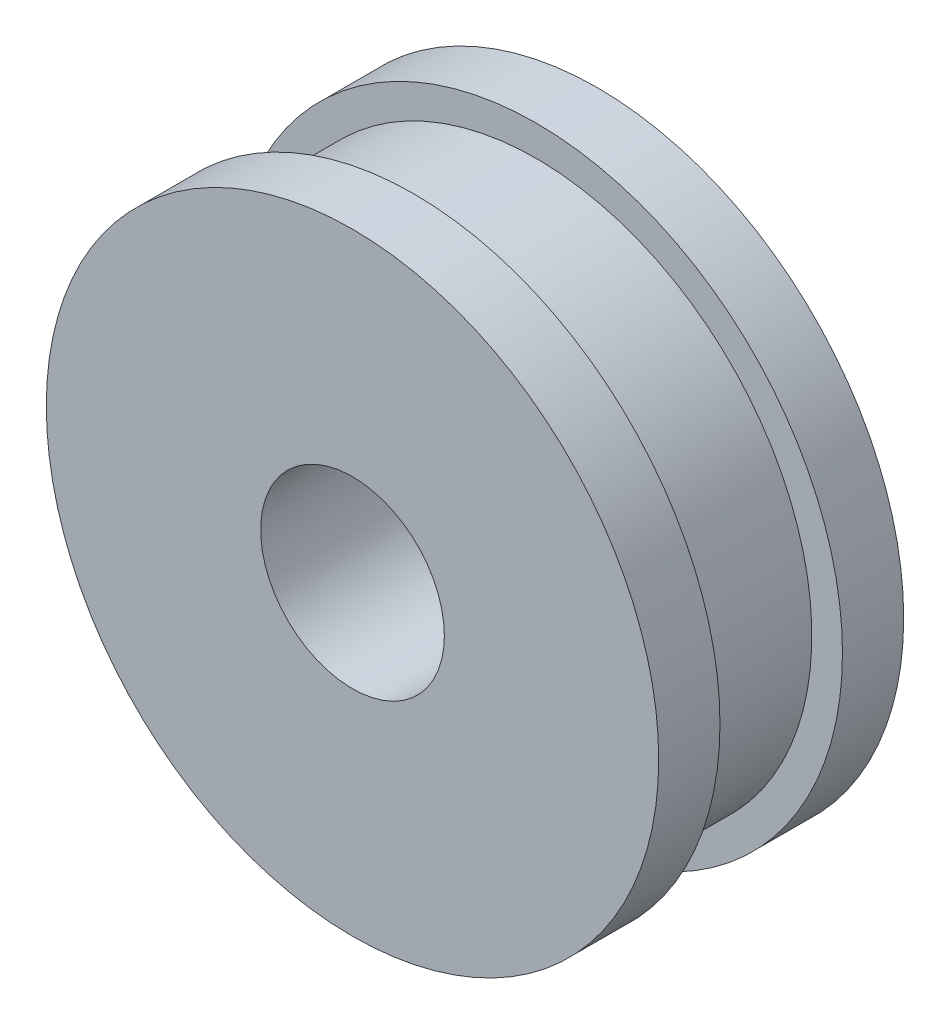
ISO-10303-21;
HEADER;
FILE_DESCRIPTION(('STEP AP214'),'2;1');
FILE_NAME('part.step','',(''),(''),'','','');
FILE_SCHEMA(('AUTOMOTIVE_DESIGN { 1 0 10303 214 1 1 1 1 }'));
ENDSEC;
DATA;
#1=APPLICATION_CONTEXT('core data for automotive mechanical design processes');
#2=APPLICATION_PROTOCOL_DEFINITION('international standard','automotive_design',2000,#1);
#3=PRODUCT_CONTEXT('',#1,'mechanical');
#4=PRODUCT('Part','Part','',(#3));
#5=PRODUCT_RELATED_PRODUCT_CATEGORY('part','',(#4));
#6=PRODUCT_DEFINITION_FORMATION('','',#4);
#7=PRODUCT_DEFINITION_CONTEXT('part definition',#1,'design');
#8=PRODUCT_DEFINITION('design','',#6,#7);
#9=PRODUCT_DEFINITION_SHAPE('','',#8);
#10=(LENGTH_UNIT() NAMED_UNIT(*) SI_UNIT(.MILLI.,.METRE.));
#11=(NAMED_UNIT(*) PLANE_ANGLE_UNIT() SI_UNIT($,.RADIAN.));
#12=(NAMED_UNIT(*) SI_UNIT($,.STERADIAN.) SOLID_ANGLE_UNIT());
#13=UNCERTAINTY_MEASURE_WITH_UNIT(LENGTH_MEASURE(1.E-05),#10,'distance_accuracy_value','');
#14=(GEOMETRIC_REPRESENTATION_CONTEXT(3) GLOBAL_UNCERTAINTY_ASSIGNED_CONTEXT((#13)) GLOBAL_UNIT_ASSIGNED_CONTEXT((#10,
#11,#12)) REPRESENTATION_CONTEXT('',''));
#15=CARTESIAN_POINT('',(0.,0.,0.));
#16=DIRECTION('',(0.,0.,1.));
#17=DIRECTION('',(1.,0.,0.));
#18=AXIS2_PLACEMENT_3D('',#15,#16,#17);
#19=CARTESIAN_POINT('',(0.,0.,40.));
#20=DIRECTION('',(0.,0.,-1.));
#21=DIRECTION('',(-1.,0.,0.));
#22=AXIS2_PLACEMENT_3D('',#19,#20,#21);
#23=CYLINDRICAL_SURFACE('',#22,50.);
#24=CARTESIAN_POINT('',(0.,0.,30.));
#25=DIRECTION('',(0.,0.,-1.));
#26=DIRECTION('',(-1.,0.,0.));
#27=AXIS2_PLACEMENT_3D('',#24,#25,#26);
#28=CIRCLE('',#27,50.);
#29=CARTESIAN_POINT('',(-50.,0.,30.));
#30=VERTEX_POINT('',#29);
#31=EDGE_CURVE('E58',#30,#30,#28,.T.);
#32=ORIENTED_EDGE('',*,*,#31,.F.);
#33=EDGE_LOOP('',(#32));
#34=FACE_BOUND('',#33,.T.);
#35=CARTESIAN_POINT('',(0.,0.,40.));
#36=DIRECTION('',(0.,0.,1.));
#37=DIRECTION('',(1.,0.,0.));
#38=AXIS2_PLACEMENT_3D('',#35,#36,#37);
#39=CIRCLE('',#38,50.);
#40=CARTESIAN_POINT('',(50.,0.,40.));
#41=VERTEX_POINT('',#40);
#42=EDGE_CURVE('E10',#41,#41,#39,.T.);
#43=ORIENTED_EDGE('',*,*,#42,.F.);
#44=EDGE_LOOP('',(#43));
#45=FACE_BOUND('',#44,.T.);
#46=ADVANCED_FACE('F31',(#34,#45),#23,.T.);
#47=CARTESIAN_POINT('',(0.,0.,40.));
#48=DIRECTION('',(0.,0.,1.));
#49=DIRECTION('',(1.,0.,0.));
#50=AXIS2_PLACEMENT_3D('',#47,#48,#49);
#51=PLANE('',#50);
#52=ORIENTED_EDGE('',*,*,#42,.T.);
#53=EDGE_LOOP('',(#52));
#54=FACE_BOUND('',#53,.T.);
#55=CARTESIAN_POINT('',(0.,0.,40.));
#56=DIRECTION('',(0.,0.,1.));
#57=DIRECTION('',(1.,0.,0.));
#58=AXIS2_PLACEMENT_3D('',#55,#56,#57);
#59=CIRCLE('',#58,15.);
#60=CARTESIAN_POINT('',(15.,0.,40.));
#61=VERTEX_POINT('',#60);
#62=EDGE_CURVE('E42',#61,#61,#59,.T.);
#63=ORIENTED_EDGE('',*,*,#62,.F.);
#64=EDGE_LOOP('',(#63));
#65=FACE_BOUND('',#64,.T.);
#66=ADVANCED_FACE('F66',(#54,#65),#51,.T.);
#67=CARTESIAN_POINT('',(0.,0.,0.));
#68=DIRECTION('',(0.,0.,1.));
#69=DIRECTION('',(1.,0.,0.));
#70=AXIS2_PLACEMENT_3D('',#67,#68,#69);
#71=PLANE('',#70);
#72=CARTESIAN_POINT('',(0.,0.,0.));
#73=DIRECTION('',(0.,0.,1.));
#74=DIRECTION('',(1.,0.,0.));
#75=AXIS2_PLACEMENT_3D('',#72,#73,#74);
#76=CIRCLE('',#75,50.);
#77=CARTESIAN_POINT('',(50.,0.,0.));
#78=VERTEX_POINT('',#77);
#79=EDGE_CURVE('E35',#78,#78,#76,.T.);
#80=ORIENTED_EDGE('',*,*,#79,.F.);
#81=EDGE_LOOP('',(#80));
#82=FACE_BOUND('',#81,.T.);
#83=CARTESIAN_POINT('',(0.,0.,0.));
#84=DIRECTION('',(0.,0.,1.));
#85=DIRECTION('',(1.,0.,0.));
#86=AXIS2_PLACEMENT_3D('',#83,#84,#85);
#87=CIRCLE('',#86,15.);
#88=CARTESIAN_POINT('',(15.,0.,0.));
#89=VERTEX_POINT('',#88);
#90=EDGE_CURVE('E44',#89,#89,#87,.T.);
#91=ORIENTED_EDGE('',*,*,#90,.T.);
#92=EDGE_LOOP('',(#91));
#93=FACE_BOUND('',#92,.T.);
#94=ADVANCED_FACE('F70',(#82,#93),#71,.F.);
#95=CARTESIAN_POINT('',(0.,0.,10.));
#96=DIRECTION('',(0.,0.,-1.));
#97=DIRECTION('',(-1.,0.,0.));
#98=AXIS2_PLACEMENT_3D('',#95,#96,#97);
#99=CIRCLE('',#98,50.);
#100=CARTESIAN_POINT('',(-50.,0.,10.));
#101=VERTEX_POINT('',#100);
#102=EDGE_CURVE('E55',#101,#101,#99,.T.);
#103=ORIENTED_EDGE('',*,*,#102,.T.);
#104=EDGE_LOOP('',(#103));
#105=FACE_BOUND('',#104,.T.);
#106=ORIENTED_EDGE('',*,*,#79,.T.);
#107=EDGE_LOOP('',(#106));
#108=FACE_BOUND('',#107,.T.);
#109=ADVANCED_FACE('F33',(#105,#108),#23,.T.);
#110=CARTESIAN_POINT('',(0.,0.,40.));
#111=DIRECTION('',(0.,0.,-1.));
#112=DIRECTION('',(-1.,0.,0.));
#113=AXIS2_PLACEMENT_3D('',#110,#111,#112);
#114=CYLINDRICAL_SURFACE('',#113,15.);
#115=ORIENTED_EDGE('',*,*,#62,.T.);
#116=EDGE_LOOP('',(#115));
#117=FACE_BOUND('',#116,.T.);
#118=ORIENTED_EDGE('',*,*,#90,.F.);
#119=EDGE_LOOP('',(#118));
#120=FACE_BOUND('',#119,.T.);
#121=ADVANCED_FACE('F73',(#117,#120),#114,.F.);
#122=CARTESIAN_POINT('',(0.,50.,30.));
#123=DIRECTION('',(0.,0.,1.));
#124=DIRECTION('',(1.,0.,0.));
#125=AXIS2_PLACEMENT_3D('',#122,#123,#124);
#126=PLANE('',#125);
#127=CARTESIAN_POINT('',(0.,0.,30.));
#128=DIRECTION('',(0.,0.,-1.));
#129=DIRECTION('',(-1.,0.,0.));
#130=AXIS2_PLACEMENT_3D('',#127,#128,#129);
#131=CIRCLE('',#130,45.);
#132=CARTESIAN_POINT('',(-45.,0.,30.));
#133=VERTEX_POINT('',#132);
#134=EDGE_CURVE('E47',#133,#133,#131,.T.);
#135=ORIENTED_EDGE('',*,*,#134,.F.);
#136=EDGE_LOOP('',(#135));
#137=FACE_BOUND('',#136,.T.);
#138=ORIENTED_EDGE('',*,*,#31,.T.);
#139=EDGE_LOOP('',(#138));
#140=FACE_BOUND('',#139,.T.);
#141=ADVANCED_FACE('F62',(#137,#140),#126,.F.);
#142=CARTESIAN_POINT('',(0.,0.,-46.8792952371695));
#143=DIRECTION('',(0.,0.,-1.));
#144=DIRECTION('',(-1.,0.,0.));
#145=AXIS2_PLACEMENT_3D('',#142,#143,#144);
#146=CYLINDRICAL_SURFACE('',#145,45.);
#147=CARTESIAN_POINT('',(0.,0.,10.));
#148=DIRECTION('',(0.,0.,-1.));
#149=DIRECTION('',(-1.,0.,0.));
#150=AXIS2_PLACEMENT_3D('',#147,#148,#149);
#151=CIRCLE('',#150,45.);
#152=CARTESIAN_POINT('',(-45.,0.,10.));
#153=VERTEX_POINT('',#152);
#154=EDGE_CURVE('E52',#153,#153,#151,.T.);
#155=ORIENTED_EDGE('',*,*,#154,.F.);
#156=EDGE_LOOP('',(#155));
#157=FACE_BOUND('',#156,.T.);
#158=ORIENTED_EDGE('',*,*,#134,.T.);
#159=EDGE_LOOP('',(#158));
#160=FACE_BOUND('',#159,.T.);
#161=ADVANCED_FACE('F92',(#157,#160),#146,.T.);
#162=CARTESIAN_POINT('',(0.,50.,10.));
#163=DIRECTION('',(0.,0.,-1.));
#164=DIRECTION('',(-1.,0.,0.));
#165=AXIS2_PLACEMENT_3D('',#162,#163,#164);
#166=PLANE('',#165);
#167=ORIENTED_EDGE('',*,*,#102,.F.);
#168=EDGE_LOOP('',(#167));
#169=FACE_BOUND('',#168,.T.);
#170=ORIENTED_EDGE('',*,*,#154,.T.);
#171=EDGE_LOOP('',(#170));
#172=FACE_BOUND('',#171,.T.);
#173=ADVANCED_FACE('F89',(#169,#172),#166,.F.);
#174=CLOSED_SHELL('',(#46,#66,#94,#109,#121,#141,#161,#173));
#175=MANIFOLD_SOLID_BREP('B2',#174);
#176=ADVANCED_BREP_SHAPE_REPRESENTATION('',(#18,#175),#14);
#177=SHAPE_DEFINITION_REPRESENTATION(#9,#176);
ENDSEC;
END-ISO-10303-21;
